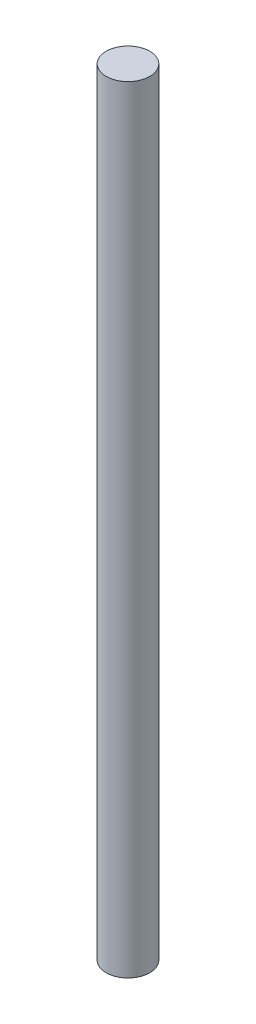
ISO-10303-21;
HEADER;
FILE_DESCRIPTION(('STEP AP214'),'2;1');
FILE_NAME('part.step','',(''),(''),'','','');
FILE_SCHEMA(('AUTOMOTIVE_DESIGN { 1 0 10303 214 1 1 1 1 }'));
ENDSEC;
DATA;
#1=APPLICATION_CONTEXT('core data for automotive mechanical design processes');
#2=APPLICATION_PROTOCOL_DEFINITION('international standard','automotive_design',2000,#1);
#3=PRODUCT_CONTEXT('',#1,'mechanical');
#4=PRODUCT('Part','Part','',(#3));
#5=PRODUCT_RELATED_PRODUCT_CATEGORY('part','',(#4));
#6=PRODUCT_DEFINITION_FORMATION('','',#4);
#7=PRODUCT_DEFINITION_CONTEXT('part definition',#1,'design');
#8=PRODUCT_DEFINITION('design','',#6,#7);
#9=PRODUCT_DEFINITION_SHAPE('','',#8);
#10=(LENGTH_UNIT() NAMED_UNIT(*) SI_UNIT(.MILLI.,.METRE.));
#11=(NAMED_UNIT(*) PLANE_ANGLE_UNIT() SI_UNIT($,.RADIAN.));
#12=(NAMED_UNIT(*) SI_UNIT($,.STERADIAN.) SOLID_ANGLE_UNIT());
#13=UNCERTAINTY_MEASURE_WITH_UNIT(LENGTH_MEASURE(1.E-05),#10,'distance_accuracy_value','');
#14=(GEOMETRIC_REPRESENTATION_CONTEXT(3) GLOBAL_UNCERTAINTY_ASSIGNED_CONTEXT((#13)) GLOBAL_UNIT_ASSIGNED_CONTEXT((#10,
#11,#12)) REPRESENTATION_CONTEXT('',''));
#15=CARTESIAN_POINT('',(0.,0.,0.));
#16=DIRECTION('',(0.,0.,1.));
#17=DIRECTION('',(1.,0.,0.));
#18=AXIS2_PLACEMENT_3D('',#15,#16,#17);
#19=CARTESIAN_POINT('',(0.,200.,0.));
#20=DIRECTION('',(0.,-1.,0.));
#21=DIRECTION('',(0.,0.,-1.));
#22=AXIS2_PLACEMENT_3D('',#19,#20,#21);
#23=CYLINDRICAL_SURFACE('',#22,5.62);
#24=CARTESIAN_POINT('',(0.,200.,0.));
#25=DIRECTION('',(0.,1.,0.));
#26=DIRECTION('',(0.,0.,1.));
#27=AXIS2_PLACEMENT_3D('',#24,#25,#26);
#28=CIRCLE('',#27,5.62);
#29=CARTESIAN_POINT('',(0.,200.,5.62));
#30=VERTEX_POINT('',#29);
#31=EDGE_CURVE('E10',#30,#30,#28,.T.);
#32=ORIENTED_EDGE('',*,*,#31,.F.);
#33=EDGE_LOOP('',(#32));
#34=FACE_BOUND('',#33,.T.);
#35=CARTESIAN_POINT('',(0.,0.,0.));
#36=DIRECTION('',(0.,1.,0.));
#37=DIRECTION('',(0.,0.,1.));
#38=AXIS2_PLACEMENT_3D('',#35,#36,#37);
#39=CIRCLE('',#38,5.62);
#40=CARTESIAN_POINT('',(0.,0.,5.62));
#41=VERTEX_POINT('',#40);
#42=EDGE_CURVE('E37',#41,#41,#39,.T.);
#43=ORIENTED_EDGE('',*,*,#42,.T.);
#44=EDGE_LOOP('',(#43));
#45=FACE_BOUND('',#44,.T.);
#46=ADVANCED_FACE('F34',(#34,#45),#23,.T.);
#47=CARTESIAN_POINT('',(0.,200.,0.));
#48=DIRECTION('',(0.,1.,0.));
#49=DIRECTION('',(0.,0.,1.));
#50=AXIS2_PLACEMENT_3D('',#47,#48,#49);
#51=PLANE('',#50);
#52=ORIENTED_EDGE('',*,*,#31,.T.);
#53=EDGE_LOOP('',(#52));
#54=FACE_BOUND('',#53,.T.);
#55=ADVANCED_FACE('F49',(#54),#51,.T.);
#56=CARTESIAN_POINT('',(0.,0.,0.));
#57=DIRECTION('',(0.,1.,0.));
#58=DIRECTION('',(0.,0.,1.));
#59=AXIS2_PLACEMENT_3D('',#56,#57,#58);
#60=PLANE('',#59);
#61=ORIENTED_EDGE('',*,*,#42,.F.);
#62=EDGE_LOOP('',(#61));
#63=FACE_BOUND('',#62,.T.);
#64=ADVANCED_FACE('F47',(#63),#60,.F.);
#65=CLOSED_SHELL('',(#46,#55,#64));
#66=MANIFOLD_SOLID_BREP('B2',#65);
#67=ADVANCED_BREP_SHAPE_REPRESENTATION('',(#18,#66),#14);
#68=SHAPE_DEFINITION_REPRESENTATION(#9,#67);
ENDSEC;
END-ISO-10303-21;
